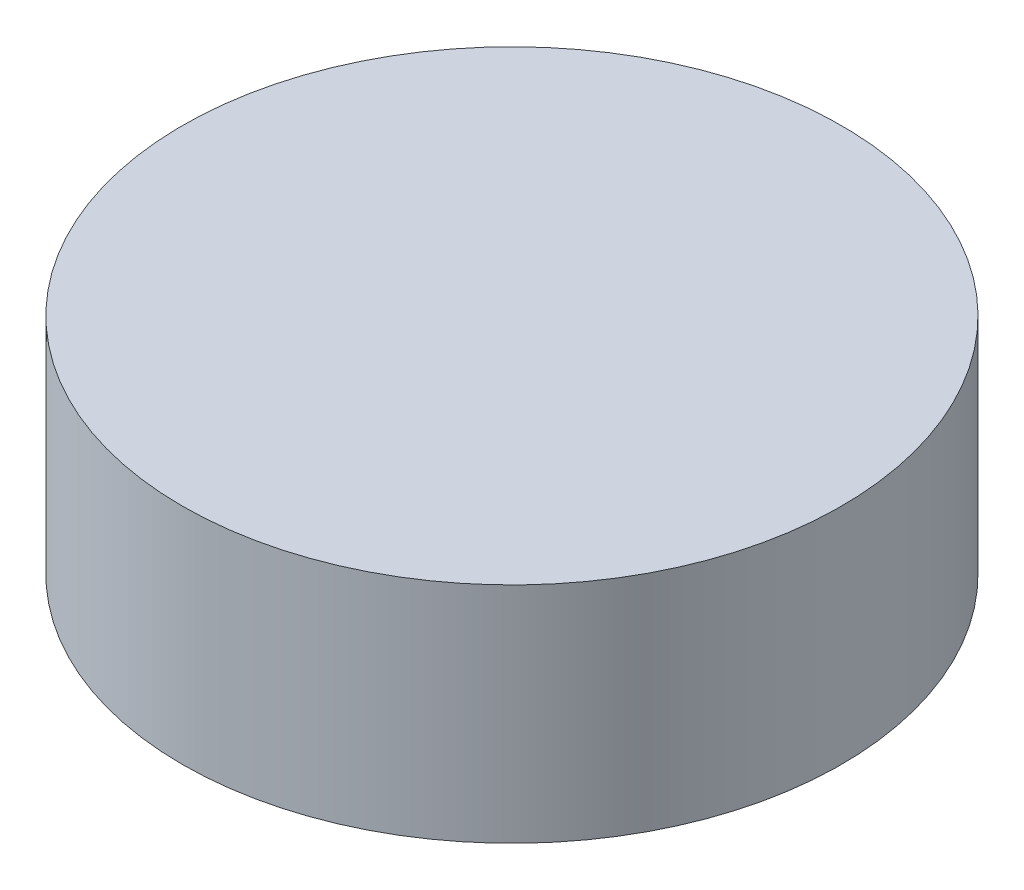
ISO-10303-21;
HEADER;
FILE_DESCRIPTION(('STEP AP214'),'2;1');
FILE_NAME('part.step','',(''),(''),'','','');
FILE_SCHEMA(('AUTOMOTIVE_DESIGN { 1 0 10303 214 1 1 1 1 }'));
ENDSEC;
DATA;
#1=APPLICATION_CONTEXT('core data for automotive mechanical design processes');
#2=APPLICATION_PROTOCOL_DEFINITION('international standard','automotive_design',2000,#1);
#3=PRODUCT_CONTEXT('',#1,'mechanical');
#4=PRODUCT('Part','Part','',(#3));
#5=PRODUCT_RELATED_PRODUCT_CATEGORY('part','',(#4));
#6=PRODUCT_DEFINITION_FORMATION('','',#4);
#7=PRODUCT_DEFINITION_CONTEXT('part definition',#1,'design');
#8=PRODUCT_DEFINITION('design','',#6,#7);
#9=PRODUCT_DEFINITION_SHAPE('','',#8);
#10=(LENGTH_UNIT() NAMED_UNIT(*) SI_UNIT(.MILLI.,.METRE.));
#11=(NAMED_UNIT(*) PLANE_ANGLE_UNIT() SI_UNIT($,.RADIAN.));
#12=(NAMED_UNIT(*) SI_UNIT($,.STERADIAN.) SOLID_ANGLE_UNIT());
#13=UNCERTAINTY_MEASURE_WITH_UNIT(LENGTH_MEASURE(1.E-05),#10,'distance_accuracy_value','');
#14=(GEOMETRIC_REPRESENTATION_CONTEXT(3) GLOBAL_UNCERTAINTY_ASSIGNED_CONTEXT((#13)) GLOBAL_UNIT_ASSIGNED_CONTEXT((#10,
#11,#12)) REPRESENTATION_CONTEXT('',''));
#15=CARTESIAN_POINT('',(0.,0.,0.));
#16=DIRECTION('',(0.,0.,1.));
#17=DIRECTION('',(1.,0.,0.));
#18=AXIS2_PLACEMENT_3D('',#15,#16,#17);
#19=CARTESIAN_POINT('',(0.,30.,0.));
#20=DIRECTION('',(0.,-1.,0.));
#21=DIRECTION('',(0.,0.,-1.));
#22=AXIS2_PLACEMENT_3D('',#19,#20,#21);
#23=CYLINDRICAL_SURFACE('',#22,44.1844400447113);
#24=CARTESIAN_POINT('',(0.,30.,0.));
#25=DIRECTION('',(0.,1.,0.));
#26=DIRECTION('',(0.,0.,1.));
#27=AXIS2_PLACEMENT_3D('',#24,#25,#26);
#28=CIRCLE('',#27,44.1844400447113);
#29=CARTESIAN_POINT('',(0.,30.,44.1844400447113));
#30=VERTEX_POINT('',#29);
#31=EDGE_CURVE('E10',#30,#30,#28,.T.);
#32=ORIENTED_EDGE('',*,*,#31,.F.);
#33=EDGE_LOOP('',(#32));
#34=FACE_BOUND('',#33,.T.);
#35=CARTESIAN_POINT('',(0.,0.,0.));
#36=DIRECTION('',(0.,1.,0.));
#37=DIRECTION('',(0.,0.,1.));
#38=AXIS2_PLACEMENT_3D('',#35,#36,#37);
#39=CIRCLE('',#38,44.1844400447113);
#40=CARTESIAN_POINT('',(0.,0.,44.1844400447113));
#41=VERTEX_POINT('',#40);
#42=EDGE_CURVE('E40',#41,#41,#39,.T.);
#43=ORIENTED_EDGE('',*,*,#42,.T.);
#44=EDGE_LOOP('',(#43));
#45=FACE_BOUND('',#44,.T.);
#46=ADVANCED_FACE('F37',(#34,#45),#23,.T.);
#47=CARTESIAN_POINT('',(0.,30.,0.));
#48=DIRECTION('',(0.,1.,0.));
#49=DIRECTION('',(0.,0.,1.));
#50=AXIS2_PLACEMENT_3D('',#47,#48,#49);
#51=PLANE('',#50);
#52=ORIENTED_EDGE('',*,*,#31,.T.);
#53=EDGE_LOOP('',(#52));
#54=FACE_BOUND('',#53,.T.);
#55=ADVANCED_FACE('F54',(#54),#51,.T.);
#56=CARTESIAN_POINT('',(0.,0.,0.));
#57=DIRECTION('',(0.,1.,0.));
#58=DIRECTION('',(0.,0.,1.));
#59=AXIS2_PLACEMENT_3D('',#56,#57,#58);
#60=PLANE('',#59);
#61=ORIENTED_EDGE('',*,*,#42,.F.);
#62=EDGE_LOOP('',(#61));
#63=FACE_BOUND('',#62,.T.);
#64=ADVANCED_FACE('F52',(#63),#60,.F.);
#65=CLOSED_SHELL('',(#46,#55,#64));
#66=MANIFOLD_SOLID_BREP('B2',#65);
#67=ADVANCED_BREP_SHAPE_REPRESENTATION('',(#18,#66),#14);
#68=SHAPE_DEFINITION_REPRESENTATION(#9,#67);
ENDSEC;
END-ISO-10303-21;
